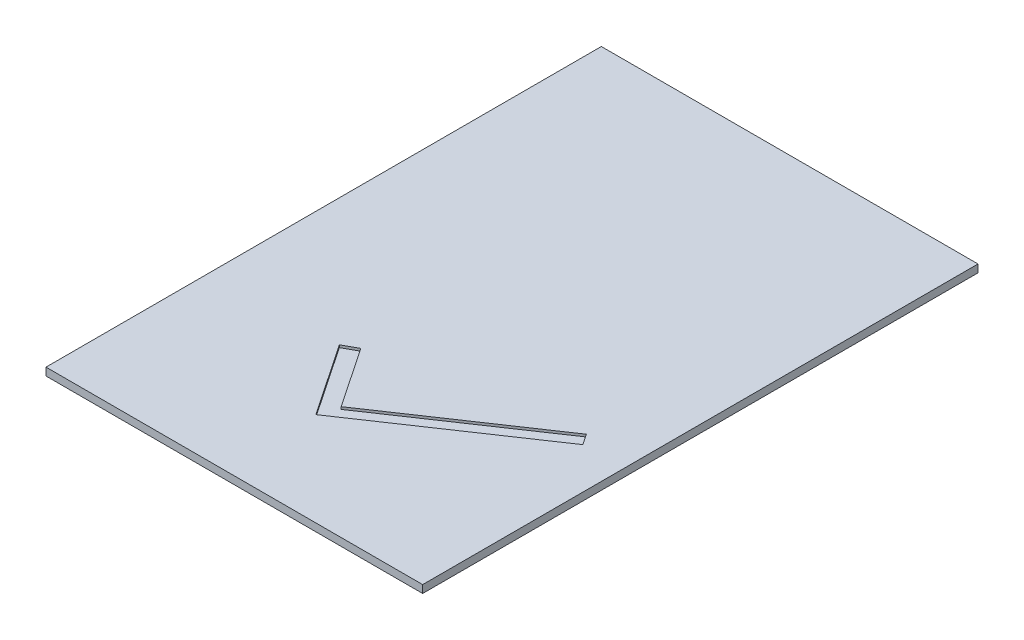
ISO-10303-21;
HEADER;
FILE_DESCRIPTION(('STEP AP214'),'2;1');
FILE_NAME('part.step','',(''),(''),'','','');
FILE_SCHEMA(('AUTOMOTIVE_DESIGN { 1 0 10303 214 1 1 1 1 }'));
ENDSEC;
DATA;
#1=APPLICATION_CONTEXT('core data for automotive mechanical design processes');
#2=APPLICATION_PROTOCOL_DEFINITION('international standard','automotive_design',2000,#1);
#3=PRODUCT_CONTEXT('',#1,'mechanical');
#4=PRODUCT('Part','Part','',(#3));
#5=PRODUCT_RELATED_PRODUCT_CATEGORY('part','',(#4));
#6=PRODUCT_DEFINITION_FORMATION('','',#4);
#7=PRODUCT_DEFINITION_CONTEXT('part definition',#1,'design');
#8=PRODUCT_DEFINITION('design','',#6,#7);
#9=PRODUCT_DEFINITION_SHAPE('','',#8);
#10=(LENGTH_UNIT() NAMED_UNIT(*) SI_UNIT(.MILLI.,.METRE.));
#11=(NAMED_UNIT(*) PLANE_ANGLE_UNIT() SI_UNIT($,.RADIAN.));
#12=(NAMED_UNIT(*) SI_UNIT($,.STERADIAN.) SOLID_ANGLE_UNIT());
#13=UNCERTAINTY_MEASURE_WITH_UNIT(LENGTH_MEASURE(1.E-05),#10,'distance_accuracy_value','');
#14=(GEOMETRIC_REPRESENTATION_CONTEXT(3) GLOBAL_UNCERTAINTY_ASSIGNED_CONTEXT((#13)) GLOBAL_UNIT_ASSIGNED_CONTEXT((#10,
#11,#12)) REPRESENTATION_CONTEXT('',''));
#15=CARTESIAN_POINT('',(0.,0.,0.));
#16=DIRECTION('',(0.,0.,1.));
#17=DIRECTION('',(1.,0.,0.));
#18=AXIS2_PLACEMENT_3D('',#15,#16,#17);
#19=CARTESIAN_POINT('',(0.,1.6,0.));
#20=DIRECTION('',(1.,0.,0.));
#21=DIRECTION('',(0.,0.,-1.));
#22=AXIS2_PLACEMENT_3D('',#19,#20,#21);
#23=PLANE('',#22);
#24=DIRECTION('',(0.,0.,1.));
#25=VECTOR('',#24,1.);
#26=CARTESIAN_POINT('',(0.,0.,0.));
#27=LINE('',#26,#25);
#28=CARTESIAN_POINT('',(0.,0.,-115.));
#29=VERTEX_POINT('',#28);
#30=CARTESIAN_POINT('',(0.,0.,0.));
#31=VERTEX_POINT('',#30);
#32=EDGE_CURVE('E164',#29,#31,#27,.T.);
#33=ORIENTED_EDGE('',*,*,#32,.T.);
#34=DIRECTION('',(0.,-1.,0.));
#35=VECTOR('',#34,1.);
#36=CARTESIAN_POINT('',(0.,1.6,0.));
#37=LINE('',#36,#35);
#38=CARTESIAN_POINT('',(0.,1.6,0.));
#39=VERTEX_POINT('',#38);
#40=EDGE_CURVE('E11',#39,#31,#37,.T.);
#41=ORIENTED_EDGE('',*,*,#40,.F.);
#42=DIRECTION('',(0.,0.,1.));
#43=VECTOR('',#42,1.);
#44=CARTESIAN_POINT('',(0.,1.6,0.));
#45=LINE('',#44,#43);
#46=CARTESIAN_POINT('',(0.,1.6,-115.));
#47=VERTEX_POINT('',#46);
#48=EDGE_CURVE('E172',#47,#39,#45,.T.);
#49=ORIENTED_EDGE('',*,*,#48,.F.);
#50=DIRECTION('',(0.,-1.,0.));
#51=VECTOR('',#50,1.);
#52=CARTESIAN_POINT('',(0.,1.6,-115.));
#53=LINE('',#52,#51);
#54=EDGE_CURVE('E178',#47,#29,#53,.T.);
#55=ORIENTED_EDGE('',*,*,#54,.T.);
#56=EDGE_LOOP('',(#33,#41,#49,#55));
#57=FACE_BOUND('',#56,.T.);
#58=ADVANCED_FACE('F32',(#57),#23,.F.);
#59=CARTESIAN_POINT('',(0.,1.6,0.));
#60=DIRECTION('',(0.,0.,-1.));
#61=DIRECTION('',(-1.,0.,0.));
#62=AXIS2_PLACEMENT_3D('',#59,#60,#61);
#63=PLANE('',#62);
#64=DIRECTION('',(1.,0.,0.));
#65=VECTOR('',#64,1.);
#66=CARTESIAN_POINT('',(0.,0.,0.));
#67=LINE('',#66,#65);
#68=CARTESIAN_POINT('',(78.,0.,0.));
#69=VERTEX_POINT('',#68);
#70=EDGE_CURVE('E181',#31,#69,#67,.T.);
#71=ORIENTED_EDGE('',*,*,#70,.T.);
#72=DIRECTION('',(0.,-1.,0.));
#73=VECTOR('',#72,1.);
#74=CARTESIAN_POINT('',(78.,1.6,0.));
#75=LINE('',#74,#73);
#76=CARTESIAN_POINT('',(78.,1.6,0.));
#77=VERTEX_POINT('',#76);
#78=EDGE_CURVE('E39',#77,#69,#75,.T.);
#79=ORIENTED_EDGE('',*,*,#78,.F.);
#80=DIRECTION('',(1.,0.,0.));
#81=VECTOR('',#80,1.);
#82=CARTESIAN_POINT('',(0.,1.6,0.));
#83=LINE('',#82,#81);
#84=EDGE_CURVE('E83',#39,#77,#83,.T.);
#85=ORIENTED_EDGE('',*,*,#84,.F.);
#86=ORIENTED_EDGE('',*,*,#40,.T.);
#87=EDGE_LOOP('',(#71,#79,#85,#86));
#88=FACE_BOUND('',#87,.T.);
#89=ADVANCED_FACE('F210',(#88),#63,.F.);
#90=CARTESIAN_POINT('',(78.,1.6,0.));
#91=DIRECTION('',(-1.,0.,0.));
#92=DIRECTION('',(0.,0.,1.));
#93=AXIS2_PLACEMENT_3D('',#90,#91,#92);
#94=PLANE('',#93);
#95=DIRECTION('',(0.,0.,-1.));
#96=VECTOR('',#95,1.);
#97=CARTESIAN_POINT('',(78.,0.,0.));
#98=LINE('',#97,#96);
#99=CARTESIAN_POINT('',(78.,0.,-115.));
#100=VERTEX_POINT('',#99);
#101=EDGE_CURVE('E183',#69,#100,#98,.T.);
#102=ORIENTED_EDGE('',*,*,#101,.T.);
#103=DIRECTION('',(0.,-1.,0.));
#104=VECTOR('',#103,1.);
#105=CARTESIAN_POINT('',(78.,1.6,-115.));
#106=LINE('',#105,#104);
#107=CARTESIAN_POINT('',(78.,1.6,-115.));
#108=VERTEX_POINT('',#107);
#109=EDGE_CURVE('E187',#108,#100,#106,.T.);
#110=ORIENTED_EDGE('',*,*,#109,.F.);
#111=DIRECTION('',(0.,0.,-1.));
#112=VECTOR('',#111,1.);
#113=CARTESIAN_POINT('',(78.,1.6,0.));
#114=LINE('',#113,#112);
#115=EDGE_CURVE('E175',#77,#108,#114,.T.);
#116=ORIENTED_EDGE('',*,*,#115,.F.);
#117=ORIENTED_EDGE('',*,*,#78,.T.);
#118=EDGE_LOOP('',(#102,#110,#116,#117));
#119=FACE_BOUND('',#118,.T.);
#120=ADVANCED_FACE('F192',(#119),#94,.F.);
#121=CARTESIAN_POINT('',(0.,1.6,-115.));
#122=DIRECTION('',(0.,0.,1.));
#123=DIRECTION('',(1.,0.,0.));
#124=AXIS2_PLACEMENT_3D('',#121,#122,#123);
#125=PLANE('',#124);
#126=DIRECTION('',(-1.,0.,0.));
#127=VECTOR('',#126,1.);
#128=CARTESIAN_POINT('',(0.,0.,-115.));
#129=LINE('',#128,#127);
#130=EDGE_CURVE('E76',#100,#29,#129,.T.);
#131=ORIENTED_EDGE('',*,*,#130,.T.);
#132=ORIENTED_EDGE('',*,*,#54,.F.);
#133=DIRECTION('',(-1.,0.,0.));
#134=VECTOR('',#133,1.);
#135=CARTESIAN_POINT('',(0.,1.6,-115.));
#136=LINE('',#135,#134);
#137=EDGE_CURVE('E55',#108,#47,#136,.T.);
#138=ORIENTED_EDGE('',*,*,#137,.F.);
#139=ORIENTED_EDGE('',*,*,#109,.T.);
#140=EDGE_LOOP('',(#131,#132,#138,#139));
#141=FACE_BOUND('',#140,.T.);
#142=ADVANCED_FACE('F200',(#141),#125,.F.);
#143=CARTESIAN_POINT('',(0.,1.6,0.));
#144=DIRECTION('',(0.,-1.,0.));
#145=DIRECTION('',(0.,0.,-1.));
#146=AXIS2_PLACEMENT_3D('',#143,#144,#145);
#147=PLANE('',#146);
#148=DIRECTION('',(0.558853462072303,0.,0.829266427591158));
#149=VECTOR('',#148,1.);
#150=CARTESIAN_POINT('',(36.4555785574169,1.6,-19.417432427166));
#151=LINE('',#150,#149);
#152=CARTESIAN_POINT('',(26.3794808596416,1.6,-34.3690612690261));
#153=VERTEX_POINT('',#152);
#154=CARTESIAN_POINT('',(36.4555785574169,1.6,-19.417432427166));
#155=VERTEX_POINT('',#154);
#156=EDGE_CURVE('E152',#153,#155,#151,.T.);
#157=ORIENTED_EDGE('',*,*,#156,.F.);
#158=DIRECTION('',(-0.874562134617834,0.,0.484913469283642));
#159=VECTOR('',#158,1.);
#160=CARTESIAN_POINT('',(26.3794808596416,1.6,-34.3690612690261));
#161=LINE('',#160,#159);
#162=CARTESIAN_POINT('',(29.2391115997094,1.6,-35.9546243847245));
#163=VERTEX_POINT('',#162);
#164=EDGE_CURVE('E46',#163,#153,#161,.T.);
#165=ORIENTED_EDGE('',*,*,#164,.F.);
#166=DIRECTION('',(-0.558853462072303,0.,-0.829266427591158));
#167=VECTOR('',#166,1.);
#168=CARTESIAN_POINT('',(29.2391115997094,1.6,-35.9546243847245));
#169=LINE('',#168,#167);
#170=CARTESIAN_POINT('',(37.6482519302022,1.6,-23.4765451846384));
#171=VERTEX_POINT('',#170);
#172=EDGE_CURVE('E138',#171,#163,#169,.T.);
#173=ORIENTED_EDGE('',*,*,#172,.F.);
#174=DIRECTION('',(-0.829266427591158,0.,0.558853462072303));
#175=VECTOR('',#174,1.);
#176=CARTESIAN_POINT('',(37.6482519302022,1.6,-23.4765451846384));
#177=LINE('',#176,#175);
#178=CARTESIAN_POINT('',(67.9857154503202,1.6,-43.9213575568919));
#179=VERTEX_POINT('',#178);
#180=EDGE_CURVE('E141',#179,#171,#177,.T.);
#181=ORIENTED_EDGE('',*,*,#180,.F.);
#182=DIRECTION('',(-0.558853462072304,0.,-0.829266427591157));
#183=VECTOR('',#182,1.);
#184=CARTESIAN_POINT('',(67.9857154503202,1.6,-43.9213575568919));
#185=LINE('',#184,#183);
#186=CARTESIAN_POINT('',(69.4943718302061,1.6,-41.6827061544805));
#187=VERTEX_POINT('',#186);
#188=EDGE_CURVE('E157',#187,#179,#185,.T.);
#189=ORIENTED_EDGE('',*,*,#188,.F.);
#190=DIRECTION('',(0.829266427591158,0.,-0.558853462072303));
#191=VECTOR('',#190,1.);
#192=CARTESIAN_POINT('',(69.4943718302061,1.6,-41.6827061544805));
#193=LINE('',#192,#191);
#194=EDGE_CURVE('E154',#155,#187,#193,.T.);
#195=ORIENTED_EDGE('',*,*,#194,.F.);
#196=EDGE_LOOP('',(#157,#165,#173,#181,#189,#195));
#197=FACE_BOUND('',#196,.T.);
#198=ORIENTED_EDGE('',*,*,#48,.T.);
#199=ORIENTED_EDGE('',*,*,#84,.T.);
#200=ORIENTED_EDGE('',*,*,#115,.T.);
#201=ORIENTED_EDGE('',*,*,#137,.T.);
#202=EDGE_LOOP('',(#198,#199,#200,#201));
#203=FACE_BOUND('',#202,.T.);
#204=ADVANCED_FACE('F202',(#197,#203),#147,.F.);
#205=CARTESIAN_POINT('',(0.,0.,0.));
#206=DIRECTION('',(0.,-1.,0.));
#207=DIRECTION('',(0.,0.,-1.));
#208=AXIS2_PLACEMENT_3D('',#205,#206,#207);
#209=PLANE('',#208);
#210=ORIENTED_EDGE('',*,*,#32,.F.);
#211=ORIENTED_EDGE('',*,*,#130,.F.);
#212=ORIENTED_EDGE('',*,*,#101,.F.);
#213=ORIENTED_EDGE('',*,*,#70,.F.);
#214=EDGE_LOOP('',(#210,#211,#212,#213));
#215=FACE_BOUND('',#214,.T.);
#216=ADVANCED_FACE('F196',(#215),#209,.T.);
#217=CARTESIAN_POINT('',(26.3794808596416,1.1,-34.3690612690261));
#218=DIRECTION('',(-0.484913469283642,0.,-0.874562134617834));
#219=DIRECTION('',(-0.874562134617834,0.,0.484913469283642));
#220=AXIS2_PLACEMENT_3D('',#217,#218,#219);
#221=PLANE('',#220);
#222=ORIENTED_EDGE('',*,*,#164,.T.);
#223=DIRECTION('',(0.,1.,0.));
#224=VECTOR('',#223,1.);
#225=CARTESIAN_POINT('',(26.3794808596416,1.1,-34.3690612690261));
#226=LINE('',#225,#224);
#227=CARTESIAN_POINT('',(26.3794808596416,1.1,-34.3690612690261));
#228=VERTEX_POINT('',#227);
#229=EDGE_CURVE('E115',#228,#153,#226,.T.);
#230=ORIENTED_EDGE('',*,*,#229,.F.);
#231=DIRECTION('',(-0.874562134617834,0.,0.484913469283642));
#232=VECTOR('',#231,1.);
#233=CARTESIAN_POINT('',(26.3794808596416,1.1,-34.3690612690261));
#234=LINE('',#233,#232);
#235=CARTESIAN_POINT('',(29.2391115997094,1.1,-35.9546243847245));
#236=VERTEX_POINT('',#235);
#237=EDGE_CURVE('E119',#236,#228,#234,.T.);
#238=ORIENTED_EDGE('',*,*,#237,.F.);
#239=DIRECTION('',(0.,1.,0.));
#240=VECTOR('',#239,1.);
#241=CARTESIAN_POINT('',(29.2391115997094,1.1,-35.9546243847245));
#242=LINE('',#241,#240);
#243=EDGE_CURVE('E162',#236,#163,#242,.T.);
#244=ORIENTED_EDGE('',*,*,#243,.T.);
#245=EDGE_LOOP('',(#222,#230,#238,#244));
#246=FACE_BOUND('',#245,.T.);
#247=ADVANCED_FACE('F117',(#246),#221,.F.);
#248=CARTESIAN_POINT('',(29.2391115997094,1.1,-35.9546243847245));
#249=DIRECTION('',(0.829266427591158,0.,-0.558853462072303));
#250=DIRECTION('',(-0.558853462072303,0.,-0.829266427591158));
#251=AXIS2_PLACEMENT_3D('',#248,#249,#250);
#252=PLANE('',#251);
#253=ORIENTED_EDGE('',*,*,#172,.T.);
#254=ORIENTED_EDGE('',*,*,#243,.F.);
#255=DIRECTION('',(-0.558853462072303,0.,-0.829266427591158));
#256=VECTOR('',#255,1.);
#257=CARTESIAN_POINT('',(29.2391115997094,1.1,-35.9546243847245));
#258=LINE('',#257,#256);
#259=CARTESIAN_POINT('',(37.6482519302022,1.1,-23.4765451846384));
#260=VERTEX_POINT('',#259);
#261=EDGE_CURVE('E125',#260,#236,#258,.T.);
#262=ORIENTED_EDGE('',*,*,#261,.F.);
#263=DIRECTION('',(0.,1.,0.));
#264=VECTOR('',#263,1.);
#265=CARTESIAN_POINT('',(37.6482519302022,1.1,-23.4765451846384));
#266=LINE('',#265,#264);
#267=EDGE_CURVE('E165',#260,#171,#266,.T.);
#268=ORIENTED_EDGE('',*,*,#267,.T.);
#269=EDGE_LOOP('',(#253,#254,#262,#268));
#270=FACE_BOUND('',#269,.T.);
#271=ADVANCED_FACE('F249',(#270),#252,.F.);
#272=CARTESIAN_POINT('',(37.6482519302022,1.1,-23.4765451846384));
#273=DIRECTION('',(-0.558853462072303,0.,-0.829266427591158));
#274=DIRECTION('',(-0.829266427591158,0.,0.558853462072303));
#275=AXIS2_PLACEMENT_3D('',#272,#273,#274);
#276=PLANE('',#275);
#277=ORIENTED_EDGE('',*,*,#180,.T.);
#278=ORIENTED_EDGE('',*,*,#267,.F.);
#279=DIRECTION('',(-0.829266427591158,0.,0.558853462072303));
#280=VECTOR('',#279,1.);
#281=CARTESIAN_POINT('',(37.6482519302022,1.1,-23.4765451846384));
#282=LINE('',#281,#280);
#283=CARTESIAN_POINT('',(67.9857154503202,1.1,-43.9213575568919));
#284=VERTEX_POINT('',#283);
#285=EDGE_CURVE('E148',#284,#260,#282,.T.);
#286=ORIENTED_EDGE('',*,*,#285,.F.);
#287=DIRECTION('',(0.,1.,0.));
#288=VECTOR('',#287,1.);
#289=CARTESIAN_POINT('',(67.9857154503202,1.1,-43.9213575568919));
#290=LINE('',#289,#288);
#291=EDGE_CURVE('E167',#284,#179,#290,.T.);
#292=ORIENTED_EDGE('',*,*,#291,.T.);
#293=EDGE_LOOP('',(#277,#278,#286,#292));
#294=FACE_BOUND('',#293,.T.);
#295=ADVANCED_FACE('F258',(#294),#276,.F.);
#296=CARTESIAN_POINT('',(67.9857154503202,1.1,-43.9213575568919));
#297=DIRECTION('',(0.829266427591157,0.,-0.558853462072304));
#298=DIRECTION('',(-0.558853462072304,0.,-0.829266427591157));
#299=AXIS2_PLACEMENT_3D('',#296,#297,#298);
#300=PLANE('',#299);
#301=ORIENTED_EDGE('',*,*,#188,.T.);
#302=ORIENTED_EDGE('',*,*,#291,.F.);
#303=DIRECTION('',(-0.558853462072304,0.,-0.829266427591157));
#304=VECTOR('',#303,1.);
#305=CARTESIAN_POINT('',(67.9857154503202,1.1,-43.9213575568919));
#306=LINE('',#305,#304);
#307=CARTESIAN_POINT('',(69.4943718302061,1.1,-41.6827061544805));
#308=VERTEX_POINT('',#307);
#309=EDGE_CURVE('E145',#308,#284,#306,.T.);
#310=ORIENTED_EDGE('',*,*,#309,.F.);
#311=DIRECTION('',(0.,1.,0.));
#312=VECTOR('',#311,1.);
#313=CARTESIAN_POINT('',(69.4943718302061,1.1,-41.6827061544805));
#314=LINE('',#313,#312);
#315=EDGE_CURVE('E169',#308,#187,#314,.T.);
#316=ORIENTED_EDGE('',*,*,#315,.T.);
#317=EDGE_LOOP('',(#301,#302,#310,#316));
#318=FACE_BOUND('',#317,.T.);
#319=ADVANCED_FACE('F268',(#318),#300,.F.);
#320=CARTESIAN_POINT('',(69.4943718302061,1.1,-41.6827061544805));
#321=DIRECTION('',(0.558853462072303,0.,0.829266427591158));
#322=DIRECTION('',(0.829266427591158,0.,-0.558853462072303));
#323=AXIS2_PLACEMENT_3D('',#320,#321,#322);
#324=PLANE('',#323);
#325=ORIENTED_EDGE('',*,*,#194,.T.);
#326=ORIENTED_EDGE('',*,*,#315,.F.);
#327=DIRECTION('',(0.829266427591158,0.,-0.558853462072303));
#328=VECTOR('',#327,1.);
#329=CARTESIAN_POINT('',(69.4943718302061,1.1,-41.6827061544805));
#330=LINE('',#329,#328);
#331=CARTESIAN_POINT('',(36.4555785574169,1.1,-19.417432427166));
#332=VERTEX_POINT('',#331);
#333=EDGE_CURVE('E133',#332,#308,#330,.T.);
#334=ORIENTED_EDGE('',*,*,#333,.F.);
#335=DIRECTION('',(0.,1.,0.));
#336=VECTOR('',#335,1.);
#337=CARTESIAN_POINT('',(36.4555785574169,1.1,-19.417432427166));
#338=LINE('',#337,#336);
#339=EDGE_CURVE('E124',#332,#155,#338,.T.);
#340=ORIENTED_EDGE('',*,*,#339,.T.);
#341=EDGE_LOOP('',(#325,#326,#334,#340));
#342=FACE_BOUND('',#341,.T.);
#343=ADVANCED_FACE('F278',(#342),#324,.F.);
#344=CARTESIAN_POINT('',(36.4555785574169,1.1,-19.417432427166));
#345=DIRECTION('',(-0.829266427591158,0.,0.558853462072303));
#346=DIRECTION('',(0.558853462072303,0.,0.829266427591158));
#347=AXIS2_PLACEMENT_3D('',#344,#345,#346);
#348=PLANE('',#347);
#349=ORIENTED_EDGE('',*,*,#156,.T.);
#350=ORIENTED_EDGE('',*,*,#339,.F.);
#351=DIRECTION('',(0.558853462072303,0.,0.829266427591158));
#352=VECTOR('',#351,1.);
#353=CARTESIAN_POINT('',(36.4555785574169,1.1,-19.417432427166));
#354=LINE('',#353,#352);
#355=EDGE_CURVE('E128',#228,#332,#354,.T.);
#356=ORIENTED_EDGE('',*,*,#355,.F.);
#357=ORIENTED_EDGE('',*,*,#229,.T.);
#358=EDGE_LOOP('',(#349,#350,#356,#357));
#359=FACE_BOUND('',#358,.T.);
#360=ADVANCED_FACE('F129',(#359),#348,.F.);
#361=CARTESIAN_POINT('',(0.,1.1,0.));
#362=DIRECTION('',(0.,-1.,0.));
#363=DIRECTION('',(0.,0.,-1.));
#364=AXIS2_PLACEMENT_3D('',#361,#362,#363);
#365=PLANE('',#364);
#366=ORIENTED_EDGE('',*,*,#237,.T.);
#367=ORIENTED_EDGE('',*,*,#355,.T.);
#368=ORIENTED_EDGE('',*,*,#333,.T.);
#369=ORIENTED_EDGE('',*,*,#309,.T.);
#370=ORIENTED_EDGE('',*,*,#285,.T.);
#371=ORIENTED_EDGE('',*,*,#261,.T.);
#372=EDGE_LOOP('',(#366,#367,#368,#369,#370,#371));
#373=FACE_BOUND('',#372,.T.);
#374=ADVANCED_FACE('F135',(#373),#365,.F.);
#375=CLOSED_SHELL('',(#58,#89,#120,#142,#204,#216,#247,#271,#295,#319,#343,#360,#374));
#376=MANIFOLD_SOLID_BREP('B2',#375);
#377=ADVANCED_BREP_SHAPE_REPRESENTATION('',(#18,#376),#14);
#378=SHAPE_DEFINITION_REPRESENTATION(#9,#377);
ENDSEC;
END-ISO-10303-21;
